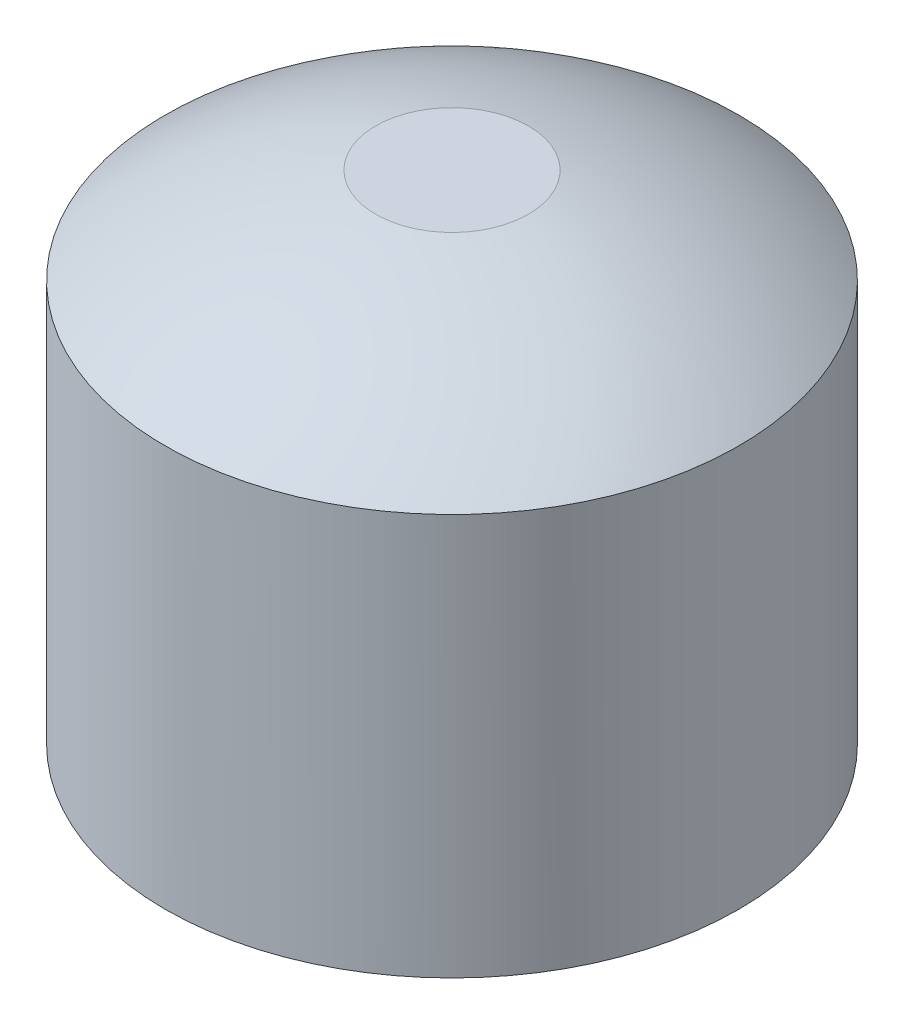
ISO-10303-21;
HEADER;
FILE_DESCRIPTION(('STEP AP214'),'2;1');
FILE_NAME('part.step','',(''),(''),'','','');
FILE_SCHEMA(('AUTOMOTIVE_DESIGN { 1 0 10303 214 1 1 1 1 }'));
ENDSEC;
DATA;
#1=APPLICATION_CONTEXT('core data for automotive mechanical design processes');
#2=APPLICATION_PROTOCOL_DEFINITION('international standard','automotive_design',2000,#1);
#3=PRODUCT_CONTEXT('',#1,'mechanical');
#4=PRODUCT('Part','Part','',(#3));
#5=PRODUCT_RELATED_PRODUCT_CATEGORY('part','',(#4));
#6=PRODUCT_DEFINITION_FORMATION('','',#4);
#7=PRODUCT_DEFINITION_CONTEXT('part definition',#1,'design');
#8=PRODUCT_DEFINITION('design','',#6,#7);
#9=PRODUCT_DEFINITION_SHAPE('','',#8);
#10=(LENGTH_UNIT() NAMED_UNIT(*) SI_UNIT(.MILLI.,.METRE.));
#11=(NAMED_UNIT(*) PLANE_ANGLE_UNIT() SI_UNIT($,.RADIAN.));
#12=(NAMED_UNIT(*) SI_UNIT($,.STERADIAN.) SOLID_ANGLE_UNIT());
#13=UNCERTAINTY_MEASURE_WITH_UNIT(LENGTH_MEASURE(1.E-05),#10,'distance_accuracy_value','');
#14=(GEOMETRIC_REPRESENTATION_CONTEXT(3) GLOBAL_UNCERTAINTY_ASSIGNED_CONTEXT((#13)) GLOBAL_UNIT_ASSIGNED_CONTEXT((#10,
#11,#12)) REPRESENTATION_CONTEXT('',''));
#15=CARTESIAN_POINT('',(0.,0.,0.));
#16=DIRECTION('',(0.,0.,1.));
#17=DIRECTION('',(1.,0.,0.));
#18=AXIS2_PLACEMENT_3D('',#15,#16,#17);
#19=CARTESIAN_POINT('',(0.,0.,0.));
#20=DIRECTION('',(0.,1.,0.));
#21=DIRECTION('',(0.,0.,1.));
#22=AXIS2_PLACEMENT_3D('',#19,#20,#21);
#23=PLANE('',#22);
#24=CARTESIAN_POINT('',(0.,0.,0.));
#25=DIRECTION('',(0.,1.,0.));
#26=DIRECTION('',(0.,0.,1.));
#27=AXIS2_PLACEMENT_3D('',#24,#25,#26);
#28=CIRCLE('',#27,75.);
#29=CARTESIAN_POINT('',(0.,0.,75.));
#30=VERTEX_POINT('',#29);
#31=EDGE_CURVE('E10',#30,#30,#28,.T.);
#32=ORIENTED_EDGE('',*,*,#31,.F.);
#33=EDGE_LOOP('',(#32));
#34=FACE_BOUND('',#33,.T.);
#35=CARTESIAN_POINT('',(0.,0.,0.));
#36=DIRECTION('',(0.,1.,0.));
#37=DIRECTION('',(0.,0.,1.));
#38=AXIS2_PLACEMENT_3D('',#35,#36,#37);
#39=CIRCLE('',#38,70.);
#40=CARTESIAN_POINT('',(0.,0.,70.));
#41=VERTEX_POINT('',#40);
#42=EDGE_CURVE('E40',#41,#41,#39,.T.);
#43=ORIENTED_EDGE('',*,*,#42,.T.);
#44=EDGE_LOOP('',(#43));
#45=FACE_BOUND('',#44,.T.);
#46=ADVANCED_FACE('F33',(#34,#45),#23,.F.);
#47=CARTESIAN_POINT('',(0.,100.,0.));
#48=DIRECTION('',(0.,-1.,0.));
#49=DIRECTION('',(0.,0.,-1.));
#50=AXIS2_PLACEMENT_3D('',#47,#48,#49);
#51=CYLINDRICAL_SURFACE('',#50,75.);
#52=ORIENTED_EDGE('',*,*,#31,.T.);
#53=EDGE_LOOP('',(#52));
#54=FACE_BOUND('',#53,.T.);
#55=CARTESIAN_POINT('',(0.,105.,0.));
#56=DIRECTION('',(0.,-1.,0.));
#57=DIRECTION('',(0.,0.,-1.));
#58=AXIS2_PLACEMENT_3D('',#55,#56,#57);
#59=CIRCLE('',#58,75.);
#60=CARTESIAN_POINT('',(0.,105.,-75.));
#61=VERTEX_POINT('',#60);
#62=EDGE_CURVE('E53',#61,#61,#59,.T.);
#63=ORIENTED_EDGE('',*,*,#62,.T.);
#64=EDGE_LOOP('',(#63));
#65=FACE_BOUND('',#64,.T.);
#66=ADVANCED_FACE('F35',(#54,#65),#51,.T.);
#67=CARTESIAN_POINT('',(0.,100.,0.));
#68=DIRECTION('',(0.,-1.,0.));
#69=DIRECTION('',(0.,0.,-1.));
#70=AXIS2_PLACEMENT_3D('',#67,#68,#69);
#71=CYLINDRICAL_SURFACE('',#70,70.);
#72=CARTESIAN_POINT('',(0.,100.,0.));
#73=DIRECTION('',(0.,-1.,0.));
#74=DIRECTION('',(0.,0.,-1.));
#75=AXIS2_PLACEMENT_3D('',#72,#73,#74);
#76=CIRCLE('',#75,70.);
#77=CARTESIAN_POINT('',(0.,100.,-70.));
#78=VERTEX_POINT('',#77);
#79=EDGE_CURVE('E48',#78,#78,#76,.T.);
#80=ORIENTED_EDGE('',*,*,#79,.F.);
#81=EDGE_LOOP('',(#80));
#82=FACE_BOUND('',#81,.T.);
#83=ORIENTED_EDGE('',*,*,#42,.F.);
#84=EDGE_LOOP('',(#83));
#85=FACE_BOUND('',#84,.T.);
#86=ADVANCED_FACE('F80',(#82,#85),#71,.F.);
#87=CARTESIAN_POINT('',(0.,122.928932188134,0.));
#88=DIRECTION('',(0.,1.,0.));
#89=DIRECTION('',(0.,0.,1.));
#90=AXIS2_PLACEMENT_3D('',#87,#88,#89);
#91=PLANE('',#90);
#92=CARTESIAN_POINT('',(0.,122.928932188134,0.));
#93=DIRECTION('',(0.,-1.,0.));
#94=DIRECTION('',(0.,0.,-1.));
#95=AXIS2_PLACEMENT_3D('',#92,#93,#94);
#96=CIRCLE('',#95,20.);
#97=CARTESIAN_POINT('',(0.,122.928932188134,-20.));
#98=VERTEX_POINT('',#97);
#99=EDGE_CURVE('E44',#98,#98,#96,.T.);
#100=ORIENTED_EDGE('',*,*,#99,.T.);
#101=EDGE_LOOP('',(#100));
#102=FACE_BOUND('',#101,.T.);
#103=ADVANCED_FACE('F75',(#102),#91,.F.);
#104=CARTESIAN_POINT('',(0.,100.,70.));
#105=CARTESIAN_POINT('',(0.,117.780957155776,48.6444806195287));
#106=CARTESIAN_POINT('',(0.,122.928932188134,20.));
#107=B_SPLINE_CURVE_WITH_KNOTS('',2,(#104,#105,#106),.UNSPECIFIED.,.F.,.F.,(3,3),(0.,1.),.UNSPECIFIED.);
#108=CARTESIAN_POINT('',(0.,-20.1548725710029,0.));
#109=DIRECTION('',(0.,-1.,0.));
#110=AXIS1_PLACEMENT('',#108,#109);
#111=SURFACE_OF_REVOLUTION('',#107,#110);
#112=ORIENTED_EDGE('',*,*,#99,.F.);
#113=EDGE_LOOP('',(#112));
#114=FACE_BOUND('',#113,.T.);
#115=ORIENTED_EDGE('',*,*,#79,.T.);
#116=EDGE_LOOP('',(#115));
#117=FACE_BOUND('',#116,.T.);
#118=ADVANCED_FACE('F70',(#114,#117),#111,.T.);
#119=CARTESIAN_POINT('',(0.,130.,20.));
#120=CARTESIAN_POINT('',(0.,123.477390111112,50.6671873922264));
#121=CARTESIAN_POINT('',(0.,105.,75.));
#122=B_SPLINE_CURVE_WITH_KNOTS('',2,(#119,#120,#121),.UNSPECIFIED.,.F.,.F.,(3,3),(0.,1.),.UNSPECIFIED.);
#123=CARTESIAN_POINT('',(0.,-20.1548725710029,0.));
#124=DIRECTION('',(0.,-1.,0.));
#125=AXIS1_PLACEMENT('',#123,#124);
#126=SURFACE_OF_REVOLUTION('',#122,#125);
#127=ORIENTED_EDGE('',*,*,#62,.F.);
#128=EDGE_LOOP('',(#127));
#129=FACE_BOUND('',#128,.T.);
#130=CARTESIAN_POINT('',(0.,130.,0.));
#131=DIRECTION('',(0.,-1.,0.));
#132=DIRECTION('',(0.,0.,-1.));
#133=AXIS2_PLACEMENT_3D('',#130,#131,#132);
#134=CIRCLE('',#133,20.);
#135=CARTESIAN_POINT('',(0.,130.,-20.));
#136=VERTEX_POINT('',#135);
#137=EDGE_CURVE('E56',#136,#136,#134,.T.);
#138=ORIENTED_EDGE('',*,*,#137,.T.);
#139=EDGE_LOOP('',(#138));
#140=FACE_BOUND('',#139,.T.);
#141=ADVANCED_FACE('F74',(#129,#140),#126,.T.);
#142=CARTESIAN_POINT('',(0.,130.,0.));
#143=DIRECTION('',(0.,-1.,0.));
#144=DIRECTION('',(0.,0.,-1.));
#145=AXIS2_PLACEMENT_3D('',#142,#143,#144);
#146=PLANE('',#145);
#147=ORIENTED_EDGE('',*,*,#137,.F.);
#148=EDGE_LOOP('',(#147));
#149=FACE_BOUND('',#148,.T.);
#150=ADVANCED_FACE('F96',(#149),#146,.F.);
#151=CLOSED_SHELL('',(#46,#66,#86,#103,#118,#141,#150));
#152=MANIFOLD_SOLID_BREP('B2',#151);
#153=ADVANCED_BREP_SHAPE_REPRESENTATION('',(#18,#152),#14);
#154=SHAPE_DEFINITION_REPRESENTATION(#9,#153);
ENDSEC;
END-ISO-10303-21;
